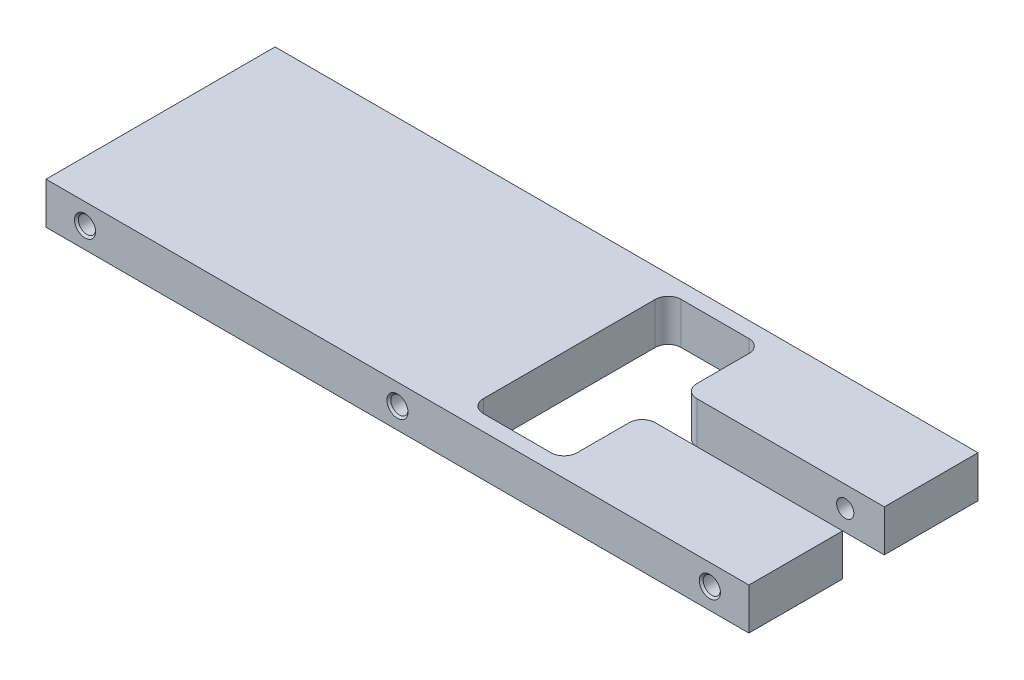
ISO-10303-21;
HEADER;
FILE_DESCRIPTION(('STEP AP214'),'2;1');
FILE_NAME('part.step','',(''),(''),'','','');
FILE_SCHEMA(('AUTOMOTIVE_DESIGN { 1 0 10303 214 1 1 1 1 }'));
ENDSEC;
DATA;
#1=APPLICATION_CONTEXT('core data for automotive mechanical design processes');
#2=APPLICATION_PROTOCOL_DEFINITION('international standard','automotive_design',2000,#1);
#3=PRODUCT_CONTEXT('',#1,'mechanical');
#4=PRODUCT('Part','Part','',(#3));
#5=PRODUCT_RELATED_PRODUCT_CATEGORY('part','',(#4));
#6=PRODUCT_DEFINITION_FORMATION('','',#4);
#7=PRODUCT_DEFINITION_CONTEXT('part definition',#1,'design');
#8=PRODUCT_DEFINITION('design','',#6,#7);
#9=PRODUCT_DEFINITION_SHAPE('','',#8);
#10=(LENGTH_UNIT() NAMED_UNIT(*) SI_UNIT(.MILLI.,.METRE.));
#11=(NAMED_UNIT(*) PLANE_ANGLE_UNIT() SI_UNIT($,.RADIAN.));
#12=(NAMED_UNIT(*) SI_UNIT($,.STERADIAN.) SOLID_ANGLE_UNIT());
#13=UNCERTAINTY_MEASURE_WITH_UNIT(LENGTH_MEASURE(1.E-05),#10,'distance_accuracy_value','');
#14=(GEOMETRIC_REPRESENTATION_CONTEXT(3) GLOBAL_UNCERTAINTY_ASSIGNED_CONTEXT((#13)) GLOBAL_UNIT_ASSIGNED_CONTEXT((#10,
#11,#12)) REPRESENTATION_CONTEXT('',''));
#15=CARTESIAN_POINT('',(0.,0.,0.));
#16=DIRECTION('',(0.,0.,1.));
#17=DIRECTION('',(1.,0.,0.));
#18=AXIS2_PLACEMENT_3D('',#15,#16,#17);
#19=CARTESIAN_POINT('',(81.5,8.,-36.));
#20=DIRECTION('',(1.,0.,0.));
#21=DIRECTION('',(0.,0.,-1.));
#22=AXIS2_PLACEMENT_3D('',#19,#20,#21);
#23=PLANE('',#22);
#24=DIRECTION('',(0.,0.,1.));
#25=VECTOR('',#24,1.);
#26=CARTESIAN_POINT('',(81.5,8.,-36.));
#27=LINE('',#26,#25);
#28=CARTESIAN_POINT('',(81.5,8.,-36.));
#29=VERTEX_POINT('',#28);
#30=CARTESIAN_POINT('',(81.5,8.,-18.));
#31=VERTEX_POINT('',#30);
#32=EDGE_CURVE('E187',#29,#31,#27,.T.);
#33=ORIENTED_EDGE('',*,*,#32,.T.);
#34=DIRECTION('',(0.,-1.,0.));
#35=VECTOR('',#34,1.);
#36=CARTESIAN_POINT('',(81.5,10.,-18.));
#37=LINE('',#36,#35);
#38=CARTESIAN_POINT('',(81.5,0.,-18.));
#39=VERTEX_POINT('',#38);
#40=EDGE_CURVE('E173',#31,#39,#37,.T.);
#41=ORIENTED_EDGE('',*,*,#40,.T.);
#42=DIRECTION('',(0.,0.,1.));
#43=VECTOR('',#42,1.);
#44=CARTESIAN_POINT('',(81.5,0.,-36.));
#45=LINE('',#44,#43);
#46=CARTESIAN_POINT('',(81.5,0.,-36.));
#47=VERTEX_POINT('',#46);
#48=EDGE_CURVE('E184',#47,#39,#45,.T.);
#49=ORIENTED_EDGE('',*,*,#48,.F.);
#50=DIRECTION('',(0.,-1.,0.));
#51=VECTOR('',#50,1.);
#52=CARTESIAN_POINT('',(81.5,8.,-36.));
#53=LINE('',#52,#51);
#54=EDGE_CURVE('E211',#29,#47,#53,.T.);
#55=ORIENTED_EDGE('',*,*,#54,.F.);
#56=EDGE_LOOP('',(#33,#41,#49,#55));
#57=FACE_BOUND('',#56,.T.);
#58=ADVANCED_FACE('F43',(#57),#23,.T.);
#59=CARTESIAN_POINT('',(0.,8.,0.));
#60=DIRECTION('',(0.,1.,0.));
#61=DIRECTION('',(0.,0.,1.));
#62=AXIS2_PLACEMENT_3D('',#59,#60,#61);
#63=PLANE('',#62);
#64=DIRECTION('',(1.,0.,0.));
#65=VECTOR('',#64,1.);
#66=CARTESIAN_POINT('',(0.,8.,-9.99999999999999));
#67=LINE('',#66,#65);
#68=CARTESIAN_POINT('',(45.5,8.,-10.));
#69=VERTEX_POINT('',#68);
#70=CARTESIAN_POINT('',(81.5,8.,-10.));
#71=VERTEX_POINT('',#70);
#72=EDGE_CURVE('E189',#69,#71,#67,.T.);
#73=ORIENTED_EDGE('',*,*,#72,.F.);
#74=CARTESIAN_POINT('',(45.5,8.,-7.5));
#75=DIRECTION('',(0.,1.,0.));
#76=DIRECTION('',(0.,0.,1.));
#77=AXIS2_PLACEMENT_3D('',#74,#75,#76);
#78=CIRCLE('',#77,2.5);
#79=CARTESIAN_POINT('',(43.,8.,-7.5));
#80=VERTEX_POINT('',#79);
#81=EDGE_CURVE('E292',#69,#80,#78,.T.);
#82=ORIENTED_EDGE('',*,*,#81,.T.);
#83=DIRECTION('',(0.,0.,-1.));
#84=VECTOR('',#83,1.);
#85=CARTESIAN_POINT('',(43.,8.,0.));
#86=LINE('',#85,#84);
#87=CARTESIAN_POINT('',(43.,8.,2.5));
#88=VERTEX_POINT('',#87);
#89=EDGE_CURVE('E338',#88,#80,#86,.T.);
#90=ORIENTED_EDGE('',*,*,#89,.F.);
#91=CARTESIAN_POINT('',(40.5,8.,2.5));
#92=DIRECTION('',(0.,1.,0.));
#93=DIRECTION('',(0.,0.,1.));
#94=AXIS2_PLACEMENT_3D('',#91,#92,#93);
#95=CIRCLE('',#94,2.5);
#96=CARTESIAN_POINT('',(40.5,8.,5.));
#97=VERTEX_POINT('',#96);
#98=EDGE_CURVE('E255',#88,#97,#95,.F.);
#99=ORIENTED_EDGE('',*,*,#98,.T.);
#100=DIRECTION('',(-1.,0.,0.));
#101=VECTOR('',#100,1.);
#102=CARTESIAN_POINT('',(0.,8.,5.));
#103=LINE('',#102,#101);
#104=CARTESIAN_POINT('',(27.5,8.,5.));
#105=VERTEX_POINT('',#104);
#106=EDGE_CURVE('E334',#97,#105,#103,.T.);
#107=ORIENTED_EDGE('',*,*,#106,.T.);
#108=CARTESIAN_POINT('',(27.5,8.,2.5));
#109=DIRECTION('',(0.,1.,0.));
#110=DIRECTION('',(0.,0.,1.));
#111=AXIS2_PLACEMENT_3D('',#108,#109,#110);
#112=CIRCLE('',#111,2.5);
#113=CARTESIAN_POINT('',(25.,8.,2.5));
#114=VERTEX_POINT('',#113);
#115=EDGE_CURVE('E261',#105,#114,#112,.F.);
#116=ORIENTED_EDGE('',*,*,#115,.T.);
#117=DIRECTION('',(0.,0.,-1.));
#118=VECTOR('',#117,1.);
#119=CARTESIAN_POINT('',(25.,8.,0.));
#120=LINE('',#119,#118);
#121=CARTESIAN_POINT('',(25.,8.,-30.5));
#122=VERTEX_POINT('',#121);
#123=EDGE_CURVE('E328',#114,#122,#120,.T.);
#124=ORIENTED_EDGE('',*,*,#123,.T.);
#125=CARTESIAN_POINT('',(27.5,8.,-30.5));
#126=DIRECTION('',(0.,1.,0.));
#127=DIRECTION('',(0.,0.,1.));
#128=AXIS2_PLACEMENT_3D('',#125,#126,#127);
#129=CIRCLE('',#128,2.5);
#130=CARTESIAN_POINT('',(27.5,8.,-33.));
#131=VERTEX_POINT('',#130);
#132=EDGE_CURVE('E267',#122,#131,#129,.F.);
#133=ORIENTED_EDGE('',*,*,#132,.T.);
#134=DIRECTION('',(-1.,0.,0.));
#135=VECTOR('',#134,1.);
#136=CARTESIAN_POINT('',(0.,8.,-33.));
#137=LINE('',#136,#135);
#138=CARTESIAN_POINT('',(40.5,8.,-33.));
#139=VERTEX_POINT('',#138);
#140=EDGE_CURVE('E325',#139,#131,#137,.T.);
#141=ORIENTED_EDGE('',*,*,#140,.F.);
#142=CARTESIAN_POINT('',(40.5,8.,-30.5));
#143=DIRECTION('',(0.,1.,0.));
#144=DIRECTION('',(0.,0.,1.));
#145=AXIS2_PLACEMENT_3D('',#142,#143,#144);
#146=CIRCLE('',#145,2.5);
#147=CARTESIAN_POINT('',(43.,8.,-30.5));
#148=VERTEX_POINT('',#147);
#149=EDGE_CURVE('E273',#139,#148,#146,.F.);
#150=ORIENTED_EDGE('',*,*,#149,.T.);
#151=DIRECTION('',(0.,0.,-1.));
#152=VECTOR('',#151,1.);
#153=CARTESIAN_POINT('',(43.,8.,0.));
#154=LINE('',#153,#152);
#155=CARTESIAN_POINT('',(43.,8.,-20.5));
#156=VERTEX_POINT('',#155);
#157=EDGE_CURVE('E323',#156,#148,#154,.T.);
#158=ORIENTED_EDGE('',*,*,#157,.F.);
#159=CARTESIAN_POINT('',(45.5,8.,-20.5));
#160=DIRECTION('',(0.,1.,0.));
#161=DIRECTION('',(0.,0.,1.));
#162=AXIS2_PLACEMENT_3D('',#159,#160,#161);
#163=CIRCLE('',#162,2.5);
#164=CARTESIAN_POINT('',(45.5,8.,-18.));
#165=VERTEX_POINT('',#164);
#166=EDGE_CURVE('E60',#156,#165,#163,.T.);
#167=ORIENTED_EDGE('',*,*,#166,.T.);
#168=DIRECTION('',(1.,0.,0.));
#169=VECTOR('',#168,1.);
#170=CARTESIAN_POINT('',(0.,8.,-18.));
#171=LINE('',#170,#169);
#172=EDGE_CURVE('E314',#165,#31,#171,.T.);
#173=ORIENTED_EDGE('',*,*,#172,.T.);
#174=ORIENTED_EDGE('',*,*,#32,.F.);
#175=DIRECTION('',(1.,0.,0.));
#176=VECTOR('',#175,1.);
#177=CARTESIAN_POINT('',(-53.5,8.,-36.));
#178=LINE('',#177,#176);
#179=CARTESIAN_POINT('',(-53.5,8.,-36.));
#180=VERTEX_POINT('',#179);
#181=EDGE_CURVE('E212',#180,#29,#178,.T.);
#182=ORIENTED_EDGE('',*,*,#181,.F.);
#183=DIRECTION('',(0.,0.,1.));
#184=VECTOR('',#183,1.);
#185=CARTESIAN_POINT('',(-53.5,8.,-36.));
#186=LINE('',#185,#184);
#187=CARTESIAN_POINT('',(-53.5,8.,8.));
#188=VERTEX_POINT('',#187);
#189=EDGE_CURVE('E202',#180,#188,#186,.T.);
#190=ORIENTED_EDGE('',*,*,#189,.T.);
#191=DIRECTION('',(1.,0.,0.));
#192=VECTOR('',#191,1.);
#193=CARTESIAN_POINT('',(-53.5,8.,8.));
#194=LINE('',#193,#192);
#195=CARTESIAN_POINT('',(81.5,8.,8.));
#196=VERTEX_POINT('',#195);
#197=EDGE_CURVE('E304',#188,#196,#194,.T.);
#198=ORIENTED_EDGE('',*,*,#197,.T.);
#199=EDGE_CURVE('E301',#71,#196,#27,.T.);
#200=ORIENTED_EDGE('',*,*,#199,.F.);
#201=EDGE_LOOP('',(#73,#82,#90,#99,#107,#116,#124,#133,#141,#150,#158,#167,#173,#174,#182,#190,
#198,#200));
#202=FACE_BOUND('',#201,.T.);
#203=ADVANCED_FACE('F426',(#202),#63,.T.);
#204=CARTESIAN_POINT('',(0.,0.,0.));
#205=DIRECTION('',(0.,1.,0.));
#206=DIRECTION('',(0.,0.,1.));
#207=AXIS2_PLACEMENT_3D('',#204,#205,#206);
#208=PLANE('',#207);
#209=DIRECTION('',(0.,0.,1.));
#210=VECTOR('',#209,1.);
#211=CARTESIAN_POINT('',(43.,0.,-10.));
#212=LINE('',#211,#210);
#213=CARTESIAN_POINT('',(43.,0.,-7.5));
#214=VERTEX_POINT('',#213);
#215=CARTESIAN_POINT('',(43.,0.,2.49999999999999));
#216=VERTEX_POINT('',#215);
#217=EDGE_CURVE('E350',#214,#216,#212,.T.);
#218=ORIENTED_EDGE('',*,*,#217,.F.);
#219=CARTESIAN_POINT('',(45.5,0.,-7.5));
#220=DIRECTION('',(0.,1.,0.));
#221=DIRECTION('',(0.,0.,1.));
#222=AXIS2_PLACEMENT_3D('',#219,#220,#221);
#223=CIRCLE('',#222,2.5);
#224=CARTESIAN_POINT('',(45.5,0.,-10.));
#225=VERTEX_POINT('',#224);
#226=EDGE_CURVE('E284',#214,#225,#223,.F.);
#227=ORIENTED_EDGE('',*,*,#226,.T.);
#228=DIRECTION('',(-1.,0.,0.));
#229=VECTOR('',#228,1.);
#230=CARTESIAN_POINT('',(81.5,0.,-10.));
#231=LINE('',#230,#229);
#232=CARTESIAN_POINT('',(81.5,0.,-10.));
#233=VERTEX_POINT('',#232);
#234=EDGE_CURVE('E346',#233,#225,#231,.T.);
#235=ORIENTED_EDGE('',*,*,#234,.F.);
#236=CARTESIAN_POINT('',(81.5,0.,8.));
#237=VERTEX_POINT('',#236);
#238=EDGE_CURVE('E198',#233,#237,#45,.T.);
#239=ORIENTED_EDGE('',*,*,#238,.T.);
#240=DIRECTION('',(1.,0.,0.));
#241=VECTOR('',#240,1.);
#242=CARTESIAN_POINT('',(-53.5,0.,8.));
#243=LINE('',#242,#241);
#244=CARTESIAN_POINT('',(-53.5,0.,8.));
#245=VERTEX_POINT('',#244);
#246=EDGE_CURVE('E204',#245,#237,#243,.T.);
#247=ORIENTED_EDGE('',*,*,#246,.F.);
#248=DIRECTION('',(0.,0.,1.));
#249=VECTOR('',#248,1.);
#250=CARTESIAN_POINT('',(-53.5,0.,-36.));
#251=LINE('',#250,#249);
#252=CARTESIAN_POINT('',(-53.5,0.,-36.));
#253=VERTEX_POINT('',#252);
#254=EDGE_CURVE('E316',#253,#245,#251,.T.);
#255=ORIENTED_EDGE('',*,*,#254,.F.);
#256=DIRECTION('',(1.,0.,0.));
#257=VECTOR('',#256,1.);
#258=CARTESIAN_POINT('',(-53.5,0.,-36.));
#259=LINE('',#258,#257);
#260=EDGE_CURVE('E196',#253,#47,#259,.T.);
#261=ORIENTED_EDGE('',*,*,#260,.T.);
#262=ORIENTED_EDGE('',*,*,#48,.T.);
#263=DIRECTION('',(-1.,0.,0.));
#264=VECTOR('',#263,1.);
#265=CARTESIAN_POINT('',(81.5,0.,-18.));
#266=LINE('',#265,#264);
#267=CARTESIAN_POINT('',(45.5,0.,-18.));
#268=VERTEX_POINT('',#267);
#269=EDGE_CURVE('E170',#39,#268,#266,.T.);
#270=ORIENTED_EDGE('',*,*,#269,.T.);
#271=CARTESIAN_POINT('',(45.5,0.,-20.5));
#272=DIRECTION('',(0.,1.,0.));
#273=DIRECTION('',(0.,0.,1.));
#274=AXIS2_PLACEMENT_3D('',#271,#272,#273);
#275=CIRCLE('',#274,2.5);
#276=CARTESIAN_POINT('',(43.,0.,-20.5));
#277=VERTEX_POINT('',#276);
#278=EDGE_CURVE('E281',#268,#277,#275,.F.);
#279=ORIENTED_EDGE('',*,*,#278,.T.);
#280=DIRECTION('',(0.,0.,1.));
#281=VECTOR('',#280,1.);
#282=CARTESIAN_POINT('',(43.,0.,-33.));
#283=LINE('',#282,#281);
#284=CARTESIAN_POINT('',(43.,0.,-30.5));
#285=VERTEX_POINT('',#284);
#286=EDGE_CURVE('E179',#285,#277,#283,.T.);
#287=ORIENTED_EDGE('',*,*,#286,.F.);
#288=CARTESIAN_POINT('',(40.5,0.,-30.5));
#289=DIRECTION('',(0.,1.,0.));
#290=DIRECTION('',(0.,0.,1.));
#291=AXIS2_PLACEMENT_3D('',#288,#289,#290);
#292=CIRCLE('',#291,2.5);
#293=CARTESIAN_POINT('',(40.5,0.,-33.));
#294=VERTEX_POINT('',#293);
#295=EDGE_CURVE('E270',#285,#294,#292,.T.);
#296=ORIENTED_EDGE('',*,*,#295,.T.);
#297=DIRECTION('',(1.,0.,0.));
#298=VECTOR('',#297,1.);
#299=CARTESIAN_POINT('',(25.,0.,-33.));
#300=LINE('',#299,#298);
#301=CARTESIAN_POINT('',(27.5,0.,-33.));
#302=VERTEX_POINT('',#301);
#303=EDGE_CURVE('E361',#302,#294,#300,.T.);
#304=ORIENTED_EDGE('',*,*,#303,.F.);
#305=CARTESIAN_POINT('',(27.5,0.,-30.5));
#306=DIRECTION('',(0.,1.,0.));
#307=DIRECTION('',(0.,0.,1.));
#308=AXIS2_PLACEMENT_3D('',#305,#306,#307);
#309=CIRCLE('',#308,2.5);
#310=CARTESIAN_POINT('',(25.,0.,-30.5));
#311=VERTEX_POINT('',#310);
#312=EDGE_CURVE('E264',#302,#311,#309,.T.);
#313=ORIENTED_EDGE('',*,*,#312,.T.);
#314=DIRECTION('',(0.,0.,1.));
#315=VECTOR('',#314,1.);
#316=CARTESIAN_POINT('',(25.,0.,-33.));
#317=LINE('',#316,#315);
#318=CARTESIAN_POINT('',(25.,0.,2.5));
#319=VERTEX_POINT('',#318);
#320=EDGE_CURVE('E357',#311,#319,#317,.T.);
#321=ORIENTED_EDGE('',*,*,#320,.T.);
#322=CARTESIAN_POINT('',(27.5,0.,2.5));
#323=DIRECTION('',(0.,1.,0.));
#324=DIRECTION('',(0.,0.,1.));
#325=AXIS2_PLACEMENT_3D('',#322,#323,#324);
#326=CIRCLE('',#325,2.5);
#327=CARTESIAN_POINT('',(27.5,0.,5.));
#328=VERTEX_POINT('',#327);
#329=EDGE_CURVE('E258',#319,#328,#326,.T.);
#330=ORIENTED_EDGE('',*,*,#329,.T.);
#331=DIRECTION('',(1.,0.,0.));
#332=VECTOR('',#331,1.);
#333=CARTESIAN_POINT('',(25.,0.,5.));
#334=LINE('',#333,#332);
#335=CARTESIAN_POINT('',(40.5,0.,5.));
#336=VERTEX_POINT('',#335);
#337=EDGE_CURVE('E353',#328,#336,#334,.T.);
#338=ORIENTED_EDGE('',*,*,#337,.T.);
#339=CARTESIAN_POINT('',(40.5,0.,2.5));
#340=DIRECTION('',(0.,1.,0.));
#341=DIRECTION('',(0.,0.,1.));
#342=AXIS2_PLACEMENT_3D('',#339,#340,#341);
#343=CIRCLE('',#342,2.5);
#344=EDGE_CURVE('E251',#336,#216,#343,.T.);
#345=ORIENTED_EDGE('',*,*,#344,.T.);
#346=EDGE_LOOP('',(#218,#227,#235,#239,#247,#255,#261,#262,#270,#279,#287,#296,#304,#313,#321,
#330,#338,#345));
#347=FACE_BOUND('',#346,.T.);
#348=ADVANCED_FACE('F193',(#347),#208,.F.);
#349=CARTESIAN_POINT('',(-53.5,8.,-36.));
#350=DIRECTION('',(1.,0.,0.));
#351=DIRECTION('',(0.,0.,-1.));
#352=AXIS2_PLACEMENT_3D('',#349,#350,#351);
#353=PLANE('',#352);
#354=ORIENTED_EDGE('',*,*,#254,.T.);
#355=DIRECTION('',(0.,-1.,0.));
#356=VECTOR('',#355,1.);
#357=CARTESIAN_POINT('',(-53.5,8.,8.));
#358=LINE('',#357,#356);
#359=EDGE_CURVE('E219',#188,#245,#358,.T.);
#360=ORIENTED_EDGE('',*,*,#359,.F.);
#361=ORIENTED_EDGE('',*,*,#189,.F.);
#362=DIRECTION('',(0.,-1.,0.));
#363=VECTOR('',#362,1.);
#364=CARTESIAN_POINT('',(-53.5,8.,-36.));
#365=LINE('',#364,#363);
#366=EDGE_CURVE('E208',#180,#253,#365,.T.);
#367=ORIENTED_EDGE('',*,*,#366,.T.);
#368=EDGE_LOOP('',(#354,#360,#361,#367));
#369=FACE_BOUND('',#368,.T.);
#370=ADVANCED_FACE('F413',(#369),#353,.F.);
#371=CARTESIAN_POINT('',(-53.5,8.,8.));
#372=DIRECTION('',(0.,0.,-1.));
#373=DIRECTION('',(-1.,0.,0.));
#374=AXIS2_PLACEMENT_3D('',#371,#372,#373);
#375=PLANE('',#374);
#376=CARTESIAN_POINT('',(-46.,4.,8.));
#377=DIRECTION('',(0.,0.,1.));
#378=DIRECTION('',(1.,0.,0.));
#379=AXIS2_PLACEMENT_3D('',#376,#377,#378);
#380=CIRCLE('',#379,2.025);
#381=CARTESIAN_POINT('',(-43.975,4.,8.));
#382=VERTEX_POINT('',#381);
#383=EDGE_CURVE('E402',#382,#382,#380,.T.);
#384=ORIENTED_EDGE('',*,*,#383,.F.);
#385=EDGE_LOOP('',(#384));
#386=FACE_BOUND('',#385,.T.);
#387=CARTESIAN_POINT('',(14.,4.,8.));
#388=DIRECTION('',(0.,0.,1.));
#389=DIRECTION('',(1.,0.,0.));
#390=AXIS2_PLACEMENT_3D('',#387,#388,#389);
#391=CIRCLE('',#390,2.025);
#392=CARTESIAN_POINT('',(16.025,4.,8.));
#393=VERTEX_POINT('',#392);
#394=EDGE_CURVE('E390',#393,#393,#391,.T.);
#395=ORIENTED_EDGE('',*,*,#394,.F.);
#396=EDGE_LOOP('',(#395));
#397=FACE_BOUND('',#396,.T.);
#398=CARTESIAN_POINT('',(74.,4.,8.));
#399=DIRECTION('',(0.,0.,1.));
#400=DIRECTION('',(1.,0.,0.));
#401=AXIS2_PLACEMENT_3D('',#398,#399,#400);
#402=CIRCLE('',#401,2.025);
#403=CARTESIAN_POINT('',(76.025,4.,8.));
#404=VERTEX_POINT('',#403);
#405=EDGE_CURVE('E378',#404,#404,#402,.T.);
#406=ORIENTED_EDGE('',*,*,#405,.F.);
#407=EDGE_LOOP('',(#406));
#408=FACE_BOUND('',#407,.T.);
#409=ORIENTED_EDGE('',*,*,#246,.T.);
#410=DIRECTION('',(0.,-1.,0.));
#411=VECTOR('',#410,1.);
#412=CARTESIAN_POINT('',(81.5,8.,8.));
#413=LINE('',#412,#411);
#414=EDGE_CURVE('E215',#196,#237,#413,.T.);
#415=ORIENTED_EDGE('',*,*,#414,.F.);
#416=ORIENTED_EDGE('',*,*,#197,.F.);
#417=ORIENTED_EDGE('',*,*,#359,.T.);
#418=EDGE_LOOP('',(#409,#415,#416,#417));
#419=FACE_BOUND('',#418,.T.);
#420=ADVANCED_FACE('F409',(#386,#397,#408,#419),#375,.F.);
#421=DIRECTION('',(0.,-1.,0.));
#422=VECTOR('',#421,1.);
#423=CARTESIAN_POINT('',(81.5,10.,-10.));
#424=LINE('',#423,#422);
#425=EDGE_CURVE('E190',#71,#233,#424,.T.);
#426=ORIENTED_EDGE('',*,*,#425,.F.);
#427=ORIENTED_EDGE('',*,*,#199,.T.);
#428=ORIENTED_EDGE('',*,*,#414,.T.);
#429=ORIENTED_EDGE('',*,*,#238,.F.);
#430=EDGE_LOOP('',(#426,#427,#428,#429));
#431=FACE_BOUND('',#430,.T.);
#432=ADVANCED_FACE('F412',(#431),#23,.T.);
#433=CARTESIAN_POINT('',(-53.5,8.,-36.));
#434=DIRECTION('',(0.,0.,-1.));
#435=DIRECTION('',(-1.,0.,0.));
#436=AXIS2_PLACEMENT_3D('',#433,#434,#435);
#437=PLANE('',#436);
#438=CARTESIAN_POINT('',(-46.,4.,-36.));
#439=DIRECTION('',(0.,0.,1.));
#440=DIRECTION('',(1.,0.,0.));
#441=AXIS2_PLACEMENT_3D('',#438,#439,#440);
#442=CIRCLE('',#441,1.64999999999998);
#443=CARTESIAN_POINT('',(-44.35,4.,-36.));
#444=VERTEX_POINT('',#443);
#445=EDGE_CURVE('E394',#444,#444,#442,.T.);
#446=ORIENTED_EDGE('',*,*,#445,.T.);
#447=EDGE_LOOP('',(#446));
#448=FACE_BOUND('',#447,.T.);
#449=CARTESIAN_POINT('',(14.,4.,-36.));
#450=DIRECTION('',(0.,0.,1.));
#451=DIRECTION('',(1.,0.,0.));
#452=AXIS2_PLACEMENT_3D('',#449,#450,#451);
#453=CIRCLE('',#452,1.64999999999999);
#454=CARTESIAN_POINT('',(15.65,4.,-36.));
#455=VERTEX_POINT('',#454);
#456=EDGE_CURVE('E382',#455,#455,#453,.T.);
#457=ORIENTED_EDGE('',*,*,#456,.T.);
#458=EDGE_LOOP('',(#457));
#459=FACE_BOUND('',#458,.T.);
#460=CARTESIAN_POINT('',(74.,4.,-36.));
#461=DIRECTION('',(0.,0.,1.));
#462=DIRECTION('',(1.,0.,0.));
#463=AXIS2_PLACEMENT_3D('',#460,#461,#462);
#464=CIRCLE('',#463,1.64999999999998);
#465=CARTESIAN_POINT('',(75.65,4.,-36.));
#466=VERTEX_POINT('',#465);
#467=EDGE_CURVE('E370',#466,#466,#464,.T.);
#468=ORIENTED_EDGE('',*,*,#467,.T.);
#469=EDGE_LOOP('',(#468));
#470=FACE_BOUND('',#469,.T.);
#471=ORIENTED_EDGE('',*,*,#260,.F.);
#472=ORIENTED_EDGE('',*,*,#366,.F.);
#473=ORIENTED_EDGE('',*,*,#181,.T.);
#474=ORIENTED_EDGE('',*,*,#54,.T.);
#475=EDGE_LOOP('',(#471,#472,#473,#474));
#476=FACE_BOUND('',#475,.T.);
#477=ADVANCED_FACE('F439',(#448,#459,#470,#476),#437,.T.);
#478=CARTESIAN_POINT('',(81.5,10.,-18.));
#479=DIRECTION('',(0.,0.,1.));
#480=DIRECTION('',(1.,0.,0.));
#481=AXIS2_PLACEMENT_3D('',#478,#479,#480);
#482=PLANE('',#481);
#483=CARTESIAN_POINT('',(74.,4.,-18.));
#484=DIRECTION('',(0.,0.,1.));
#485=DIRECTION('',(1.,0.,0.));
#486=AXIS2_PLACEMENT_3D('',#483,#484,#485);
#487=CIRCLE('',#486,1.64999999999998);
#488=CARTESIAN_POINT('',(75.65,4.,-18.));
#489=VERTEX_POINT('',#488);
#490=EDGE_CURVE('E180',#489,#489,#487,.T.);
#491=ORIENTED_EDGE('',*,*,#490,.F.);
#492=EDGE_LOOP('',(#491));
#493=FACE_BOUND('',#492,.T.);
#494=ORIENTED_EDGE('',*,*,#172,.F.);
#495=DIRECTION('',(0.,-1.,0.));
#496=VECTOR('',#495,1.);
#497=CARTESIAN_POINT('',(45.5,0.,-18.));
#498=LINE('',#497,#496);
#499=EDGE_CURVE('E53',#165,#268,#498,.T.);
#500=ORIENTED_EDGE('',*,*,#499,.T.);
#501=ORIENTED_EDGE('',*,*,#269,.F.);
#502=ORIENTED_EDGE('',*,*,#40,.F.);
#503=EDGE_LOOP('',(#494,#500,#501,#502));
#504=FACE_BOUND('',#503,.T.);
#505=ADVANCED_FACE('F172',(#493,#504),#482,.T.);
#506=CARTESIAN_POINT('',(43.,10.,-33.));
#507=DIRECTION('',(1.,0.,0.));
#508=DIRECTION('',(0.,0.,-1.));
#509=AXIS2_PLACEMENT_3D('',#506,#507,#508);
#510=PLANE('',#509);
#511=ORIENTED_EDGE('',*,*,#286,.T.);
#512=DIRECTION('',(0.,-1.,0.));
#513=VECTOR('',#512,1.);
#514=CARTESIAN_POINT('',(43.,8.,-20.5));
#515=LINE('',#514,#513);
#516=EDGE_CURVE('E11',#277,#156,#515,.F.);
#517=ORIENTED_EDGE('',*,*,#516,.T.);
#518=ORIENTED_EDGE('',*,*,#157,.T.);
#519=DIRECTION('',(0.,-1.,0.));
#520=VECTOR('',#519,1.);
#521=CARTESIAN_POINT('',(43.,0.,-30.5));
#522=LINE('',#521,#520);
#523=EDGE_CURVE('E247',#148,#285,#522,.T.);
#524=ORIENTED_EDGE('',*,*,#523,.T.);
#525=EDGE_LOOP('',(#511,#517,#518,#524));
#526=FACE_BOUND('',#525,.T.);
#527=ADVANCED_FACE('F500',(#526),#510,.F.);
#528=CARTESIAN_POINT('',(25.,10.,-33.));
#529=DIRECTION('',(0.,0.,-1.));
#530=DIRECTION('',(-1.,0.,0.));
#531=AXIS2_PLACEMENT_3D('',#528,#529,#530);
#532=PLANE('',#531);
#533=ORIENTED_EDGE('',*,*,#140,.T.);
#534=DIRECTION('',(0.,-1.,0.));
#535=VECTOR('',#534,1.);
#536=CARTESIAN_POINT('',(27.5,10.,-33.));
#537=LINE('',#536,#535);
#538=EDGE_CURVE('E243',#131,#302,#537,.T.);
#539=ORIENTED_EDGE('',*,*,#538,.T.);
#540=ORIENTED_EDGE('',*,*,#303,.T.);
#541=DIRECTION('',(0.,-1.,0.));
#542=VECTOR('',#541,1.);
#543=CARTESIAN_POINT('',(40.5,8.,-33.));
#544=LINE('',#543,#542);
#545=EDGE_CURVE('E240',#294,#139,#544,.F.);
#546=ORIENTED_EDGE('',*,*,#545,.T.);
#547=EDGE_LOOP('',(#533,#539,#540,#546));
#548=FACE_BOUND('',#547,.T.);
#549=ADVANCED_FACE('F495',(#548),#532,.F.);
#550=CARTESIAN_POINT('',(25.,10.,-33.));
#551=DIRECTION('',(1.,0.,0.));
#552=DIRECTION('',(0.,0.,-1.));
#553=AXIS2_PLACEMENT_3D('',#550,#551,#552);
#554=PLANE('',#553);
#555=ORIENTED_EDGE('',*,*,#123,.F.);
#556=DIRECTION('',(0.,-1.,0.));
#557=VECTOR('',#556,1.);
#558=CARTESIAN_POINT('',(25.,0.,2.5));
#559=LINE('',#558,#557);
#560=EDGE_CURVE('E236',#114,#319,#559,.T.);
#561=ORIENTED_EDGE('',*,*,#560,.T.);
#562=ORIENTED_EDGE('',*,*,#320,.F.);
#563=DIRECTION('',(0.,-1.,0.));
#564=VECTOR('',#563,1.);
#565=CARTESIAN_POINT('',(25.,10.,-30.5));
#566=LINE('',#565,#564);
#567=EDGE_CURVE('E233',#311,#122,#566,.F.);
#568=ORIENTED_EDGE('',*,*,#567,.T.);
#569=EDGE_LOOP('',(#555,#561,#562,#568));
#570=FACE_BOUND('',#569,.T.);
#571=ADVANCED_FACE('F488',(#570),#554,.T.);
#572=CARTESIAN_POINT('',(25.,10.,5.));
#573=DIRECTION('',(0.,0.,-1.));
#574=DIRECTION('',(-1.,0.,0.));
#575=AXIS2_PLACEMENT_3D('',#572,#573,#574);
#576=PLANE('',#575);
#577=ORIENTED_EDGE('',*,*,#106,.F.);
#578=DIRECTION('',(0.,-1.,0.));
#579=VECTOR('',#578,1.);
#580=CARTESIAN_POINT('',(40.5,10.,5.));
#581=LINE('',#580,#579);
#582=EDGE_CURVE('E226',#97,#336,#581,.T.);
#583=ORIENTED_EDGE('',*,*,#582,.T.);
#584=ORIENTED_EDGE('',*,*,#337,.F.);
#585=DIRECTION('',(0.,-1.,0.));
#586=VECTOR('',#585,1.);
#587=CARTESIAN_POINT('',(27.5,8.,5.));
#588=LINE('',#587,#586);
#589=EDGE_CURVE('E223',#328,#105,#588,.F.);
#590=ORIENTED_EDGE('',*,*,#589,.T.);
#591=EDGE_LOOP('',(#577,#583,#584,#590));
#592=FACE_BOUND('',#591,.T.);
#593=ADVANCED_FACE('F481',(#592),#576,.T.);
#594=CARTESIAN_POINT('',(43.,10.,-10.));
#595=DIRECTION('',(1.,0.,0.));
#596=DIRECTION('',(0.,0.,-1.));
#597=AXIS2_PLACEMENT_3D('',#594,#595,#596);
#598=PLANE('',#597);
#599=ORIENTED_EDGE('',*,*,#89,.T.);
#600=DIRECTION('',(0.,-1.,0.));
#601=VECTOR('',#600,1.);
#602=CARTESIAN_POINT('',(43.,10.,-7.5));
#603=LINE('',#602,#601);
#604=EDGE_CURVE('E277',#80,#214,#603,.T.);
#605=ORIENTED_EDGE('',*,*,#604,.T.);
#606=ORIENTED_EDGE('',*,*,#217,.T.);
#607=DIRECTION('',(0.,-1.,0.));
#608=VECTOR('',#607,1.);
#609=CARTESIAN_POINT('',(43.,10.,2.5));
#610=LINE('',#609,#608);
#611=EDGE_CURVE('E230',#216,#88,#610,.F.);
#612=ORIENTED_EDGE('',*,*,#611,.T.);
#613=EDGE_LOOP('',(#599,#605,#606,#612));
#614=FACE_BOUND('',#613,.T.);
#615=ADVANCED_FACE('F475',(#614),#598,.F.);
#616=CARTESIAN_POINT('',(81.5,10.,-10.));
#617=DIRECTION('',(0.,0.,1.));
#618=DIRECTION('',(1.,0.,0.));
#619=AXIS2_PLACEMENT_3D('',#616,#617,#618);
#620=PLANE('',#619);
#621=CARTESIAN_POINT('',(74.,4.,-10.));
#622=DIRECTION('',(0.,0.,1.));
#623=DIRECTION('',(1.,0.,0.));
#624=AXIS2_PLACEMENT_3D('',#621,#622,#623);
#625=CIRCLE('',#624,1.64999999999998);
#626=CARTESIAN_POINT('',(75.65,4.,-10.));
#627=VERTEX_POINT('',#626);
#628=EDGE_CURVE('E47',#627,#627,#625,.T.);
#629=ORIENTED_EDGE('',*,*,#628,.T.);
#630=EDGE_LOOP('',(#629));
#631=FACE_BOUND('',#630,.T.);
#632=ORIENTED_EDGE('',*,*,#234,.T.);
#633=DIRECTION('',(0.,-1.,0.));
#634=VECTOR('',#633,1.);
#635=CARTESIAN_POINT('',(45.5,10.,-10.));
#636=LINE('',#635,#634);
#637=EDGE_CURVE('E287',#225,#69,#636,.F.);
#638=ORIENTED_EDGE('',*,*,#637,.T.);
#639=ORIENTED_EDGE('',*,*,#72,.T.);
#640=ORIENTED_EDGE('',*,*,#425,.T.);
#641=EDGE_LOOP('',(#632,#638,#639,#640));
#642=FACE_BOUND('',#641,.T.);
#643=ADVANCED_FACE('F450',(#631,#642),#620,.F.);
#644=CARTESIAN_POINT('',(40.5,10.,2.5));
#645=DIRECTION('',(0.,-1.,0.));
#646=DIRECTION('',(0.,0.,-1.));
#647=AXIS2_PLACEMENT_3D('',#644,#645,#646);
#648=CYLINDRICAL_SURFACE('',#647,2.5);
#649=ORIENTED_EDGE('',*,*,#98,.F.);
#650=ORIENTED_EDGE('',*,*,#611,.F.);
#651=ORIENTED_EDGE('',*,*,#344,.F.);
#652=ORIENTED_EDGE('',*,*,#582,.F.);
#653=EDGE_LOOP('',(#649,#650,#651,#652));
#654=FACE_BOUND('',#653,.T.);
#655=ADVANCED_FACE('F446',(#654),#648,.F.);
#656=CARTESIAN_POINT('',(27.5,10.,2.5));
#657=DIRECTION('',(0.,1.,0.));
#658=DIRECTION('',(0.,0.,1.));
#659=AXIS2_PLACEMENT_3D('',#656,#657,#658);
#660=CYLINDRICAL_SURFACE('',#659,2.5);
#661=ORIENTED_EDGE('',*,*,#115,.F.);
#662=ORIENTED_EDGE('',*,*,#589,.F.);
#663=ORIENTED_EDGE('',*,*,#329,.F.);
#664=ORIENTED_EDGE('',*,*,#560,.F.);
#665=EDGE_LOOP('',(#661,#662,#663,#664));
#666=FACE_BOUND('',#665,.T.);
#667=ADVANCED_FACE('F449',(#666),#660,.F.);
#668=CARTESIAN_POINT('',(27.5,10.,-30.5));
#669=DIRECTION('',(0.,-1.,0.));
#670=DIRECTION('',(0.,0.,-1.));
#671=AXIS2_PLACEMENT_3D('',#668,#669,#670);
#672=CYLINDRICAL_SURFACE('',#671,2.5);
#673=ORIENTED_EDGE('',*,*,#132,.F.);
#674=ORIENTED_EDGE('',*,*,#567,.F.);
#675=ORIENTED_EDGE('',*,*,#312,.F.);
#676=ORIENTED_EDGE('',*,*,#538,.F.);
#677=EDGE_LOOP('',(#673,#674,#675,#676));
#678=FACE_BOUND('',#677,.T.);
#679=ADVANCED_FACE('F454',(#678),#672,.F.);
#680=CARTESIAN_POINT('',(40.5,10.,-30.5));
#681=DIRECTION('',(0.,1.,0.));
#682=DIRECTION('',(0.,0.,1.));
#683=AXIS2_PLACEMENT_3D('',#680,#681,#682);
#684=CYLINDRICAL_SURFACE('',#683,2.5);
#685=ORIENTED_EDGE('',*,*,#149,.F.);
#686=ORIENTED_EDGE('',*,*,#545,.F.);
#687=ORIENTED_EDGE('',*,*,#295,.F.);
#688=ORIENTED_EDGE('',*,*,#523,.F.);
#689=EDGE_LOOP('',(#685,#686,#687,#688));
#690=FACE_BOUND('',#689,.T.);
#691=ADVANCED_FACE('F458',(#690),#684,.F.);
#692=CARTESIAN_POINT('',(45.5,10.,-7.5));
#693=DIRECTION('',(0.,-1.,0.));
#694=DIRECTION('',(0.,0.,-1.));
#695=AXIS2_PLACEMENT_3D('',#692,#693,#694);
#696=CYLINDRICAL_SURFACE('',#695,2.5);
#697=ORIENTED_EDGE('',*,*,#81,.F.);
#698=ORIENTED_EDGE('',*,*,#637,.F.);
#699=ORIENTED_EDGE('',*,*,#226,.F.);
#700=ORIENTED_EDGE('',*,*,#604,.F.);
#701=EDGE_LOOP('',(#697,#698,#699,#700));
#702=FACE_BOUND('',#701,.T.);
#703=ADVANCED_FACE('F461',(#702),#696,.T.);
#704=CARTESIAN_POINT('',(45.5,10.,-20.5));
#705=DIRECTION('',(0.,1.,0.));
#706=DIRECTION('',(0.,0.,1.));
#707=AXIS2_PLACEMENT_3D('',#704,#705,#706);
#708=CYLINDRICAL_SURFACE('',#707,2.5);
#709=ORIENTED_EDGE('',*,*,#166,.F.);
#710=ORIENTED_EDGE('',*,*,#516,.F.);
#711=ORIENTED_EDGE('',*,*,#278,.F.);
#712=ORIENTED_EDGE('',*,*,#499,.F.);
#713=EDGE_LOOP('',(#709,#710,#711,#712));
#714=FACE_BOUND('',#713,.T.);
#715=ADVANCED_FACE('F45',(#714),#708,.T.);
#716=CARTESIAN_POINT('',(74.,4.,8.));
#717=DIRECTION('',(0.,0.,1.));
#718=DIRECTION('',(1.,0.,0.));
#719=AXIS2_PLACEMENT_3D('',#716,#717,#718);
#720=CYLINDRICAL_SURFACE('',#719,1.64999999999998);
#721=CARTESIAN_POINT('',(74.,4.,7.625));
#722=DIRECTION('',(0.,0.,1.));
#723=DIRECTION('',(1.,0.,0.));
#724=AXIS2_PLACEMENT_3D('',#721,#722,#723);
#725=CIRCLE('',#724,1.64999999999998);
#726=CARTESIAN_POINT('',(75.65,4.,7.625));
#727=VERTEX_POINT('',#726);
#728=EDGE_CURVE('E374',#727,#727,#725,.T.);
#729=ORIENTED_EDGE('',*,*,#728,.T.);
#730=EDGE_LOOP('',(#729));
#731=FACE_BOUND('',#730,.T.);
#732=ORIENTED_EDGE('',*,*,#628,.F.);
#733=EDGE_LOOP('',(#732));
#734=FACE_BOUND('',#733,.T.);
#735=ADVANCED_FACE('F468',(#731,#734),#720,.F.);
#736=CARTESIAN_POINT('',(74.,4.,8.));
#737=DIRECTION('',(0.,0.,1.));
#738=DIRECTION('',(1.,0.,0.));
#739=AXIS2_PLACEMENT_3D('',#736,#737,#738);
#740=CONICAL_SURFACE('',#739,2.025,0.785398163397464);
#741=ORIENTED_EDGE('',*,*,#728,.F.);
#742=EDGE_LOOP('',(#741));
#743=FACE_BOUND('',#742,.T.);
#744=ORIENTED_EDGE('',*,*,#405,.T.);
#745=EDGE_LOOP('',(#744));
#746=FACE_BOUND('',#745,.T.);
#747=ADVANCED_FACE('F522',(#743,#746),#740,.F.);
#748=ORIENTED_EDGE('',*,*,#490,.T.);
#749=EDGE_LOOP('',(#748));
#750=FACE_BOUND('',#749,.T.);
#751=ORIENTED_EDGE('',*,*,#467,.F.);
#752=EDGE_LOOP('',(#751));
#753=FACE_BOUND('',#752,.T.);
#754=ADVANCED_FACE('F518',(#750,#753),#720,.F.);
#755=CARTESIAN_POINT('',(14.,4.,8.));
#756=DIRECTION('',(0.,0.,1.));
#757=DIRECTION('',(1.,0.,0.));
#758=AXIS2_PLACEMENT_3D('',#755,#756,#757);
#759=CYLINDRICAL_SURFACE('',#758,1.64999999999999);
#760=ORIENTED_EDGE('',*,*,#456,.F.);
#761=EDGE_LOOP('',(#760));
#762=FACE_BOUND('',#761,.T.);
#763=CARTESIAN_POINT('',(14.,4.,7.625));
#764=DIRECTION('',(0.,0.,1.));
#765=DIRECTION('',(1.,0.,0.));
#766=AXIS2_PLACEMENT_3D('',#763,#764,#765);
#767=CIRCLE('',#766,1.64999999999999);
#768=CARTESIAN_POINT('',(15.65,4.,7.625));
#769=VERTEX_POINT('',#768);
#770=EDGE_CURVE('E386',#769,#769,#767,.T.);
#771=ORIENTED_EDGE('',*,*,#770,.T.);
#772=EDGE_LOOP('',(#771));
#773=FACE_BOUND('',#772,.T.);
#774=ADVANCED_FACE('F521',(#762,#773),#759,.F.);
#775=CARTESIAN_POINT('',(14.,4.,8.));
#776=DIRECTION('',(0.,0.,1.));
#777=DIRECTION('',(1.,0.,0.));
#778=AXIS2_PLACEMENT_3D('',#775,#776,#777);
#779=CONICAL_SURFACE('',#778,2.025,0.78539816339746);
#780=ORIENTED_EDGE('',*,*,#770,.F.);
#781=EDGE_LOOP('',(#780));
#782=FACE_BOUND('',#781,.T.);
#783=ORIENTED_EDGE('',*,*,#394,.T.);
#784=EDGE_LOOP('',(#783));
#785=FACE_BOUND('',#784,.T.);
#786=ADVANCED_FACE('F529',(#782,#785),#779,.F.);
#787=CARTESIAN_POINT('',(-46.,4.,8.));
#788=DIRECTION('',(0.,0.,1.));
#789=DIRECTION('',(1.,0.,0.));
#790=AXIS2_PLACEMENT_3D('',#787,#788,#789);
#791=CYLINDRICAL_SURFACE('',#790,1.64999999999998);
#792=ORIENTED_EDGE('',*,*,#445,.F.);
#793=EDGE_LOOP('',(#792));
#794=FACE_BOUND('',#793,.T.);
#795=CARTESIAN_POINT('',(-46.,4.,7.625));
#796=DIRECTION('',(0.,0.,1.));
#797=DIRECTION('',(1.,0.,0.));
#798=AXIS2_PLACEMENT_3D('',#795,#796,#797);
#799=CIRCLE('',#798,1.64999999999998);
#800=CARTESIAN_POINT('',(-44.35,4.,7.625));
#801=VERTEX_POINT('',#800);
#802=EDGE_CURVE('E398',#801,#801,#799,.T.);
#803=ORIENTED_EDGE('',*,*,#802,.T.);
#804=EDGE_LOOP('',(#803));
#805=FACE_BOUND('',#804,.T.);
#806=ADVANCED_FACE('F533',(#794,#805),#791,.F.);
#807=CARTESIAN_POINT('',(-46.,4.,8.));
#808=DIRECTION('',(0.,0.,1.));
#809=DIRECTION('',(1.,0.,0.));
#810=AXIS2_PLACEMENT_3D('',#807,#808,#809);
#811=CONICAL_SURFACE('',#810,2.025,0.785398163397464);
#812=ORIENTED_EDGE('',*,*,#802,.F.);
#813=EDGE_LOOP('',(#812));
#814=FACE_BOUND('',#813,.T.);
#815=ORIENTED_EDGE('',*,*,#383,.T.);
#816=EDGE_LOOP('',(#815));
#817=FACE_BOUND('',#816,.T.);
#818=ADVANCED_FACE('F407',(#814,#817),#811,.F.);
#819=CLOSED_SHELL('',(#58,#203,#348,#370,#420,#432,#477,#505,#527,#549,#571,#593,#615,#643,#655,
#667,#679,#691,#703,#715,#735,#747,#754,#774,#786,#806,#818));
#820=MANIFOLD_SOLID_BREP('B2',#819);
#821=ADVANCED_BREP_SHAPE_REPRESENTATION('',(#18,#820),#14);
#822=SHAPE_DEFINITION_REPRESENTATION(#9,#821);
ENDSEC;
END-ISO-10303-21;
